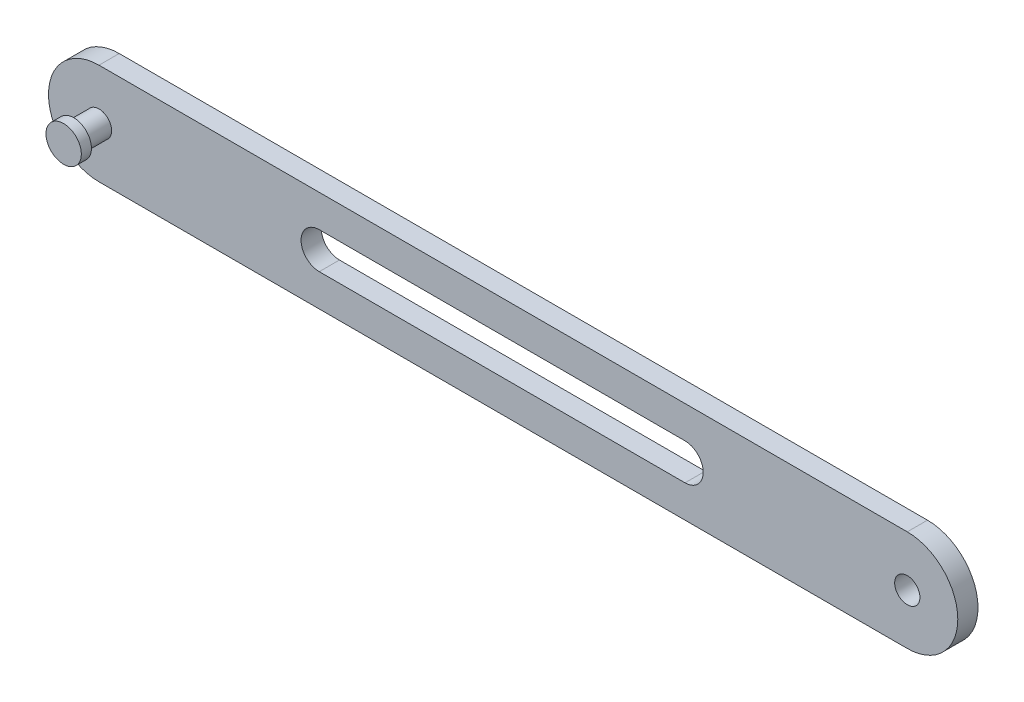
ISO-10303-21;
HEADER;
FILE_DESCRIPTION(('STEP AP214'),'2;1');
FILE_NAME('part.step','',(''),(''),'','','');
FILE_SCHEMA(('AUTOMOTIVE_DESIGN { 1 0 10303 214 1 1 1 1 }'));
ENDSEC;
DATA;
#1=APPLICATION_CONTEXT('core data for automotive mechanical design processes');
#2=APPLICATION_PROTOCOL_DEFINITION('international standard','automotive_design',2000,#1);
#3=PRODUCT_CONTEXT('',#1,'mechanical');
#4=PRODUCT('Part','Part','',(#3));
#5=PRODUCT_RELATED_PRODUCT_CATEGORY('part','',(#4));
#6=PRODUCT_DEFINITION_FORMATION('','',#4);
#7=PRODUCT_DEFINITION_CONTEXT('part definition',#1,'design');
#8=PRODUCT_DEFINITION('design','',#6,#7);
#9=PRODUCT_DEFINITION_SHAPE('','',#8);
#10=(LENGTH_UNIT() NAMED_UNIT(*) SI_UNIT(.MILLI.,.METRE.));
#11=(NAMED_UNIT(*) PLANE_ANGLE_UNIT() SI_UNIT($,.RADIAN.));
#12=(NAMED_UNIT(*) SI_UNIT($,.STERADIAN.) SOLID_ANGLE_UNIT());
#13=UNCERTAINTY_MEASURE_WITH_UNIT(LENGTH_MEASURE(1.E-05),#10,'distance_accuracy_value','');
#14=(GEOMETRIC_REPRESENTATION_CONTEXT(3) GLOBAL_UNCERTAINTY_ASSIGNED_CONTEXT((#13)) GLOBAL_UNIT_ASSIGNED_CONTEXT((#10,
#11,#12)) REPRESENTATION_CONTEXT('',''));
#15=CARTESIAN_POINT('',(0.,0.,0.));
#16=DIRECTION('',(0.,0.,1.));
#17=DIRECTION('',(1.,0.,0.));
#18=AXIS2_PLACEMENT_3D('',#15,#16,#17);
#19=CARTESIAN_POINT('',(-101.6,0.,11.43));
#20=DIRECTION('',(0.,0.,-1.));
#21=DIRECTION('',(-1.,0.,0.));
#22=AXIS2_PLACEMENT_3D('',#19,#20,#21);
#23=CYLINDRICAL_SURFACE('',#22,3.175);
#24=CARTESIAN_POINT('',(-101.6,0.,2.54));
#25=DIRECTION('',(0.,0.,1.));
#26=DIRECTION('',(1.,0.,0.));
#27=AXIS2_PLACEMENT_3D('',#24,#25,#26);
#28=CIRCLE('',#27,3.175);
#29=CARTESIAN_POINT('',(-98.425,0.,2.54));
#30=VERTEX_POINT('',#29);
#31=EDGE_CURVE('E127',#30,#30,#28,.T.);
#32=ORIENTED_EDGE('',*,*,#31,.T.);
#33=EDGE_LOOP('',(#32));
#34=FACE_BOUND('',#33,.T.);
#35=CARTESIAN_POINT('',(-101.6,0.,8.89));
#36=DIRECTION('',(0.,0.,1.));
#37=DIRECTION('',(1.,0.,0.));
#38=AXIS2_PLACEMENT_3D('',#35,#36,#37);
#39=CIRCLE('',#38,3.175);
#40=CARTESIAN_POINT('',(-98.425,0.,8.89));
#41=VERTEX_POINT('',#40);
#42=EDGE_CURVE('E11',#41,#41,#39,.T.);
#43=ORIENTED_EDGE('',*,*,#42,.F.);
#44=EDGE_LOOP('',(#43));
#45=FACE_BOUND('',#44,.T.);
#46=ADVANCED_FACE('F38',(#34,#45),#23,.T.);
#47=CARTESIAN_POINT('',(-101.6,0.,2.54));
#48=DIRECTION('',(0.,0.,1.));
#49=DIRECTION('',(1.,0.,0.));
#50=AXIS2_PLACEMENT_3D('',#47,#48,#49);
#51=PLANE('',#50);
#52=CARTESIAN_POINT('',(-101.6,0.,2.54));
#53=DIRECTION('',(0.,0.,1.));
#54=DIRECTION('',(1.,0.,0.));
#55=AXIS2_PLACEMENT_3D('',#52,#53,#54);
#56=CIRCLE('',#55,12.7);
#57=CARTESIAN_POINT('',(-101.6,12.7,2.54));
#58=VERTEX_POINT('',#57);
#59=CARTESIAN_POINT('',(-101.6,-12.7,2.54));
#60=VERTEX_POINT('',#59);
#61=EDGE_CURVE('E149',#58,#60,#56,.T.);
#62=ORIENTED_EDGE('',*,*,#61,.T.);
#63=DIRECTION('',(1.,0.,0.));
#64=VECTOR('',#63,1.);
#65=CARTESIAN_POINT('',(-101.6,-12.7,2.54));
#66=LINE('',#65,#64);
#67=CARTESIAN_POINT('',(101.6,-12.7,2.54));
#68=VERTEX_POINT('',#67);
#69=EDGE_CURVE('E152',#60,#68,#66,.T.);
#70=ORIENTED_EDGE('',*,*,#69,.T.);
#71=CARTESIAN_POINT('',(101.6,0.,2.54));
#72=DIRECTION('',(0.,0.,1.));
#73=DIRECTION('',(1.,0.,0.));
#74=AXIS2_PLACEMENT_3D('',#71,#72,#73);
#75=CIRCLE('',#74,12.7);
#76=CARTESIAN_POINT('',(101.6,12.7,2.54));
#77=VERTEX_POINT('',#76);
#78=EDGE_CURVE('E155',#68,#77,#75,.T.);
#79=ORIENTED_EDGE('',*,*,#78,.T.);
#80=DIRECTION('',(1.,0.,0.));
#81=VECTOR('',#80,1.);
#82=CARTESIAN_POINT('',(-101.6,12.7,2.54));
#83=LINE('',#82,#81);
#84=EDGE_CURVE('E157',#58,#77,#83,.T.);
#85=ORIENTED_EDGE('',*,*,#84,.F.);
#86=EDGE_LOOP('',(#62,#70,#79,#85));
#87=FACE_BOUND('',#86,.T.);
#88=CARTESIAN_POINT('',(101.6,0.,2.54));
#89=DIRECTION('',(0.,0.,1.));
#90=DIRECTION('',(1.,0.,0.));
#91=AXIS2_PLACEMENT_3D('',#88,#89,#90);
#92=CIRCLE('',#91,3.175);
#93=CARTESIAN_POINT('',(104.775,0.,2.54));
#94=VERTEX_POINT('',#93);
#95=EDGE_CURVE('E139',#94,#94,#92,.T.);
#96=ORIENTED_EDGE('',*,*,#95,.F.);
#97=EDGE_LOOP('',(#96));
#98=FACE_BOUND('',#97,.T.);
#99=CARTESIAN_POINT('',(-46.228,0.,2.54));
#100=DIRECTION('',(0.,0.,1.));
#101=DIRECTION('',(1.,0.,0.));
#102=AXIS2_PLACEMENT_3D('',#99,#100,#101);
#103=CIRCLE('',#102,4.572);
#104=CARTESIAN_POINT('',(-46.228,4.572,2.54));
#105=VERTEX_POINT('',#104);
#106=CARTESIAN_POINT('',(-46.228,-4.572,2.54));
#107=VERTEX_POINT('',#106);
#108=EDGE_CURVE('E53',#105,#107,#103,.T.);
#109=ORIENTED_EDGE('',*,*,#108,.F.);
#110=DIRECTION('',(-1.,0.,0.));
#111=VECTOR('',#110,1.);
#112=CARTESIAN_POINT('',(-46.228,4.572,2.54));
#113=LINE('',#112,#111);
#114=CARTESIAN_POINT('',(45.72,4.572,2.54));
#115=VERTEX_POINT('',#114);
#116=EDGE_CURVE('E121',#115,#105,#113,.T.);
#117=ORIENTED_EDGE('',*,*,#116,.F.);
#118=CARTESIAN_POINT('',(45.72,0.,2.54));
#119=DIRECTION('',(0.,0.,1.));
#120=DIRECTION('',(1.,0.,0.));
#121=AXIS2_PLACEMENT_3D('',#118,#119,#120);
#122=CIRCLE('',#121,4.572);
#123=CARTESIAN_POINT('',(45.72,-4.572,2.54));
#124=VERTEX_POINT('',#123);
#125=EDGE_CURVE('E124',#124,#115,#122,.T.);
#126=ORIENTED_EDGE('',*,*,#125,.F.);
#127=DIRECTION('',(1.,0.,0.));
#128=VECTOR('',#127,1.);
#129=CARTESIAN_POINT('',(-46.228,-4.572,2.54));
#130=LINE('',#129,#128);
#131=EDGE_CURVE('E133',#107,#124,#130,.T.);
#132=ORIENTED_EDGE('',*,*,#131,.F.);
#133=EDGE_LOOP('',(#109,#117,#126,#132));
#134=FACE_BOUND('',#133,.T.);
#135=ORIENTED_EDGE('',*,*,#31,.F.);
#136=EDGE_LOOP('',(#135));
#137=FACE_BOUND('',#136,.T.);
#138=ADVANCED_FACE('F194',(#87,#98,#134,#137),#51,.T.);
#139=CARTESIAN_POINT('',(-101.6,0.,2.54));
#140=DIRECTION('',(0.,0.,-1.));
#141=DIRECTION('',(-1.,0.,0.));
#142=AXIS2_PLACEMENT_3D('',#139,#140,#141);
#143=CYLINDRICAL_SURFACE('',#142,12.7);
#144=CARTESIAN_POINT('',(-101.6,0.,-2.54));
#145=DIRECTION('',(0.,0.,1.));
#146=DIRECTION('',(1.,0.,0.));
#147=AXIS2_PLACEMENT_3D('',#144,#145,#146);
#148=CIRCLE('',#147,12.7);
#149=CARTESIAN_POINT('',(-101.6,12.7,-2.54));
#150=VERTEX_POINT('',#149);
#151=CARTESIAN_POINT('',(-101.6,-12.7,-2.54));
#152=VERTEX_POINT('',#151);
#153=EDGE_CURVE('E146',#150,#152,#148,.T.);
#154=ORIENTED_EDGE('',*,*,#153,.T.);
#155=DIRECTION('',(0.,0.,-1.));
#156=VECTOR('',#155,1.);
#157=CARTESIAN_POINT('',(-101.6,-12.7,2.54));
#158=LINE('',#157,#156);
#159=EDGE_CURVE('E46',#60,#152,#158,.T.);
#160=ORIENTED_EDGE('',*,*,#159,.F.);
#161=ORIENTED_EDGE('',*,*,#61,.F.);
#162=DIRECTION('',(0.,0.,-1.));
#163=VECTOR('',#162,1.);
#164=CARTESIAN_POINT('',(-101.6,12.7,2.54));
#165=LINE('',#164,#163);
#166=EDGE_CURVE('E160',#58,#150,#165,.T.);
#167=ORIENTED_EDGE('',*,*,#166,.T.);
#168=EDGE_LOOP('',(#154,#160,#161,#167));
#169=FACE_BOUND('',#168,.T.);
#170=ADVANCED_FACE('F40',(#169),#143,.T.);
#171=CARTESIAN_POINT('',(-101.6,-12.7,2.54));
#172=DIRECTION('',(0.,1.,0.));
#173=DIRECTION('',(-1.,0.,0.));
#174=AXIS2_PLACEMENT_3D('',#171,#172,#173);
#175=PLANE('',#174);
#176=DIRECTION('',(1.,0.,0.));
#177=VECTOR('',#176,1.);
#178=CARTESIAN_POINT('',(-101.6,-12.7,-2.54));
#179=LINE('',#178,#177);
#180=CARTESIAN_POINT('',(101.6,-12.7,-2.54));
#181=VERTEX_POINT('',#180);
#182=EDGE_CURVE('E163',#152,#181,#179,.T.);
#183=ORIENTED_EDGE('',*,*,#182,.T.);
#184=DIRECTION('',(0.,0.,-1.));
#185=VECTOR('',#184,1.);
#186=CARTESIAN_POINT('',(101.6,-12.7,2.54));
#187=LINE('',#186,#185);
#188=EDGE_CURVE('E173',#68,#181,#187,.T.);
#189=ORIENTED_EDGE('',*,*,#188,.F.);
#190=ORIENTED_EDGE('',*,*,#69,.F.);
#191=ORIENTED_EDGE('',*,*,#159,.T.);
#192=EDGE_LOOP('',(#183,#189,#190,#191));
#193=FACE_BOUND('',#192,.T.);
#194=ADVANCED_FACE('F178',(#193),#175,.F.);
#195=CARTESIAN_POINT('',(101.6,0.,2.54));
#196=DIRECTION('',(0.,0.,-1.));
#197=DIRECTION('',(-1.,0.,0.));
#198=AXIS2_PLACEMENT_3D('',#195,#196,#197);
#199=CYLINDRICAL_SURFACE('',#198,12.7);
#200=CARTESIAN_POINT('',(101.6,0.,-2.54));
#201=DIRECTION('',(0.,0.,1.));
#202=DIRECTION('',(1.,0.,0.));
#203=AXIS2_PLACEMENT_3D('',#200,#201,#202);
#204=CIRCLE('',#203,12.7);
#205=CARTESIAN_POINT('',(101.6,12.7,-2.54));
#206=VERTEX_POINT('',#205);
#207=EDGE_CURVE('E165',#181,#206,#204,.T.);
#208=ORIENTED_EDGE('',*,*,#207,.T.);
#209=DIRECTION('',(0.,0.,-1.));
#210=VECTOR('',#209,1.);
#211=CARTESIAN_POINT('',(101.6,12.7,2.54));
#212=LINE('',#211,#210);
#213=EDGE_CURVE('E171',#77,#206,#212,.T.);
#214=ORIENTED_EDGE('',*,*,#213,.F.);
#215=ORIENTED_EDGE('',*,*,#78,.F.);
#216=ORIENTED_EDGE('',*,*,#188,.T.);
#217=EDGE_LOOP('',(#208,#214,#215,#216));
#218=FACE_BOUND('',#217,.T.);
#219=ADVANCED_FACE('F192',(#218),#199,.T.);
#220=CARTESIAN_POINT('',(-101.6,12.7,2.54));
#221=DIRECTION('',(0.,1.,0.));
#222=DIRECTION('',(-1.,0.,0.));
#223=AXIS2_PLACEMENT_3D('',#220,#221,#222);
#224=PLANE('',#223);
#225=DIRECTION('',(1.,0.,0.));
#226=VECTOR('',#225,1.);
#227=CARTESIAN_POINT('',(-101.6,12.7,-2.54));
#228=LINE('',#227,#226);
#229=EDGE_CURVE('E153',#150,#206,#228,.T.);
#230=ORIENTED_EDGE('',*,*,#229,.F.);
#231=ORIENTED_EDGE('',*,*,#166,.F.);
#232=ORIENTED_EDGE('',*,*,#84,.T.);
#233=ORIENTED_EDGE('',*,*,#213,.T.);
#234=EDGE_LOOP('',(#230,#231,#232,#233));
#235=FACE_BOUND('',#234,.T.);
#236=ADVANCED_FACE('F187',(#235),#224,.T.);
#237=CARTESIAN_POINT('',(-101.6,0.,-2.54));
#238=DIRECTION('',(0.,0.,1.));
#239=DIRECTION('',(1.,0.,0.));
#240=AXIS2_PLACEMENT_3D('',#237,#238,#239);
#241=PLANE('',#240);
#242=DIRECTION('',(-1.,0.,0.));
#243=VECTOR('',#242,1.);
#244=CARTESIAN_POINT('',(-46.228,4.572,-2.54));
#245=LINE('',#244,#243);
#246=CARTESIAN_POINT('',(45.72,4.572,-2.54));
#247=VERTEX_POINT('',#246);
#248=CARTESIAN_POINT('',(-46.228,4.572,-2.54));
#249=VERTEX_POINT('',#248);
#250=EDGE_CURVE('E111',#247,#249,#245,.T.);
#251=ORIENTED_EDGE('',*,*,#250,.T.);
#252=CARTESIAN_POINT('',(-46.228,0.,-2.54));
#253=DIRECTION('',(0.,0.,1.));
#254=DIRECTION('',(1.,0.,0.));
#255=AXIS2_PLACEMENT_3D('',#252,#253,#254);
#256=CIRCLE('',#255,4.572);
#257=CARTESIAN_POINT('',(-46.228,-4.572,-2.54));
#258=VERTEX_POINT('',#257);
#259=EDGE_CURVE('E105',#249,#258,#256,.T.);
#260=ORIENTED_EDGE('',*,*,#259,.T.);
#261=DIRECTION('',(1.,0.,0.));
#262=VECTOR('',#261,1.);
#263=CARTESIAN_POINT('',(-46.228,-4.572,-2.54));
#264=LINE('',#263,#262);
#265=CARTESIAN_POINT('',(45.72,-4.572,-2.54));
#266=VERTEX_POINT('',#265);
#267=EDGE_CURVE('E114',#258,#266,#264,.T.);
#268=ORIENTED_EDGE('',*,*,#267,.T.);
#269=CARTESIAN_POINT('',(45.72,0.,-2.54));
#270=DIRECTION('',(0.,0.,1.));
#271=DIRECTION('',(1.,0.,0.));
#272=AXIS2_PLACEMENT_3D('',#269,#270,#271);
#273=CIRCLE('',#272,4.572);
#274=EDGE_CURVE('E61',#266,#247,#273,.T.);
#275=ORIENTED_EDGE('',*,*,#274,.T.);
#276=EDGE_LOOP('',(#251,#260,#268,#275));
#277=FACE_BOUND('',#276,.T.);
#278=CARTESIAN_POINT('',(101.6,0.,-2.54));
#279=DIRECTION('',(0.,0.,1.));
#280=DIRECTION('',(1.,0.,0.));
#281=AXIS2_PLACEMENT_3D('',#278,#279,#280);
#282=CIRCLE('',#281,3.175);
#283=CARTESIAN_POINT('',(104.775,0.,-2.54));
#284=VERTEX_POINT('',#283);
#285=EDGE_CURVE('E143',#284,#284,#282,.T.);
#286=ORIENTED_EDGE('',*,*,#285,.T.);
#287=EDGE_LOOP('',(#286));
#288=FACE_BOUND('',#287,.T.);
#289=ORIENTED_EDGE('',*,*,#153,.F.);
#290=ORIENTED_EDGE('',*,*,#229,.T.);
#291=ORIENTED_EDGE('',*,*,#207,.F.);
#292=ORIENTED_EDGE('',*,*,#182,.F.);
#293=EDGE_LOOP('',(#289,#290,#291,#292));
#294=FACE_BOUND('',#293,.T.);
#295=ADVANCED_FACE('F118',(#277,#288,#294),#241,.F.);
#296=CARTESIAN_POINT('',(101.6,0.,-2.54));
#297=DIRECTION('',(0.,0.,1.));
#298=DIRECTION('',(1.,0.,0.));
#299=AXIS2_PLACEMENT_3D('',#296,#297,#298);
#300=CYLINDRICAL_SURFACE('',#299,3.175);
#301=ORIENTED_EDGE('',*,*,#285,.F.);
#302=EDGE_LOOP('',(#301));
#303=FACE_BOUND('',#302,.T.);
#304=ORIENTED_EDGE('',*,*,#95,.T.);
#305=EDGE_LOOP('',(#304));
#306=FACE_BOUND('',#305,.T.);
#307=ADVANCED_FACE('F244',(#303,#306),#300,.F.);
#308=CARTESIAN_POINT('',(-46.228,0.,-2.54));
#309=DIRECTION('',(0.,0.,1.));
#310=DIRECTION('',(1.,0.,0.));
#311=AXIS2_PLACEMENT_3D('',#308,#309,#310);
#312=CYLINDRICAL_SURFACE('',#311,4.572);
#313=ORIENTED_EDGE('',*,*,#108,.T.);
#314=DIRECTION('',(0.,0.,1.));
#315=VECTOR('',#314,1.);
#316=CARTESIAN_POINT('',(-46.228,-4.572,-2.54));
#317=LINE('',#316,#315);
#318=EDGE_CURVE('E101',#258,#107,#317,.T.);
#319=ORIENTED_EDGE('',*,*,#318,.F.);
#320=ORIENTED_EDGE('',*,*,#259,.F.);
#321=DIRECTION('',(0.,0.,1.));
#322=VECTOR('',#321,1.);
#323=CARTESIAN_POINT('',(-46.228,4.572,-2.54));
#324=LINE('',#323,#322);
#325=EDGE_CURVE('E137',#249,#105,#324,.T.);
#326=ORIENTED_EDGE('',*,*,#325,.T.);
#327=EDGE_LOOP('',(#313,#319,#320,#326));
#328=FACE_BOUND('',#327,.T.);
#329=ADVANCED_FACE('F103',(#328),#312,.F.);
#330=CARTESIAN_POINT('',(-46.228,4.572,-2.54));
#331=DIRECTION('',(0.,1.,0.));
#332=DIRECTION('',(0.,0.,1.));
#333=AXIS2_PLACEMENT_3D('',#330,#331,#332);
#334=PLANE('',#333);
#335=ORIENTED_EDGE('',*,*,#116,.T.);
#336=ORIENTED_EDGE('',*,*,#325,.F.);
#337=ORIENTED_EDGE('',*,*,#250,.F.);
#338=DIRECTION('',(0.,0.,1.));
#339=VECTOR('',#338,1.);
#340=CARTESIAN_POINT('',(45.72,4.572,-2.54));
#341=LINE('',#340,#339);
#342=EDGE_CURVE('E140',#247,#115,#341,.T.);
#343=ORIENTED_EDGE('',*,*,#342,.T.);
#344=EDGE_LOOP('',(#335,#336,#337,#343));
#345=FACE_BOUND('',#344,.T.);
#346=ADVANCED_FACE('F233',(#345),#334,.F.);
#347=CARTESIAN_POINT('',(45.72,0.,-2.54));
#348=DIRECTION('',(0.,0.,1.));
#349=DIRECTION('',(1.,0.,0.));
#350=AXIS2_PLACEMENT_3D('',#347,#348,#349);
#351=CYLINDRICAL_SURFACE('',#350,4.572);
#352=ORIENTED_EDGE('',*,*,#125,.T.);
#353=ORIENTED_EDGE('',*,*,#342,.F.);
#354=ORIENTED_EDGE('',*,*,#274,.F.);
#355=DIRECTION('',(0.,0.,1.));
#356=VECTOR('',#355,1.);
#357=CARTESIAN_POINT('',(45.72,-4.572,-2.54));
#358=LINE('',#357,#356);
#359=EDGE_CURVE('E110',#266,#124,#358,.T.);
#360=ORIENTED_EDGE('',*,*,#359,.T.);
#361=EDGE_LOOP('',(#352,#353,#354,#360));
#362=FACE_BOUND('',#361,.T.);
#363=ADVANCED_FACE('F236',(#362),#351,.F.);
#364=CARTESIAN_POINT('',(-46.228,-4.572,-2.54));
#365=DIRECTION('',(0.,-1.,0.));
#366=DIRECTION('',(0.,0.,-1.));
#367=AXIS2_PLACEMENT_3D('',#364,#365,#366);
#368=PLANE('',#367);
#369=ORIENTED_EDGE('',*,*,#131,.T.);
#370=ORIENTED_EDGE('',*,*,#359,.F.);
#371=ORIENTED_EDGE('',*,*,#267,.F.);
#372=ORIENTED_EDGE('',*,*,#318,.T.);
#373=EDGE_LOOP('',(#369,#370,#371,#372));
#374=FACE_BOUND('',#373,.T.);
#375=ADVANCED_FACE('F115',(#374),#368,.F.);
#376=CARTESIAN_POINT('',(-101.6,0.,8.89));
#377=DIRECTION('',(0.,0.,1.));
#378=DIRECTION('',(1.,0.,0.));
#379=AXIS2_PLACEMENT_3D('',#376,#377,#378);
#380=PLANE('',#379);
#381=CARTESIAN_POINT('',(-101.6,0.,8.89));
#382=DIRECTION('',(0.,0.,1.));
#383=DIRECTION('',(1.,0.,0.));
#384=AXIS2_PLACEMENT_3D('',#381,#382,#383);
#385=CIRCLE('',#384,4.445);
#386=CARTESIAN_POINT('',(-97.155,0.,8.89));
#387=VERTEX_POINT('',#386);
#388=EDGE_CURVE('E205',#387,#387,#385,.T.);
#389=ORIENTED_EDGE('',*,*,#388,.F.);
#390=EDGE_LOOP('',(#389));
#391=FACE_BOUND('',#390,.T.);
#392=ORIENTED_EDGE('',*,*,#42,.T.);
#393=EDGE_LOOP('',(#392));
#394=FACE_BOUND('',#393,.T.);
#395=ADVANCED_FACE('F218',(#391,#394),#380,.F.);
#396=CARTESIAN_POINT('',(-101.6,0.,8.89));
#397=DIRECTION('',(0.,0.,1.));
#398=DIRECTION('',(1.,0.,0.));
#399=AXIS2_PLACEMENT_3D('',#396,#397,#398);
#400=CYLINDRICAL_SURFACE('',#399,4.445);
#401=ORIENTED_EDGE('',*,*,#388,.T.);
#402=EDGE_LOOP('',(#401));
#403=FACE_BOUND('',#402,.T.);
#404=CARTESIAN_POINT('',(-101.6,0.,11.43));
#405=DIRECTION('',(0.,0.,1.));
#406=DIRECTION('',(1.,0.,0.));
#407=AXIS2_PLACEMENT_3D('',#404,#405,#406);
#408=CIRCLE('',#407,4.445);
#409=CARTESIAN_POINT('',(-97.155,0.,11.43));
#410=VERTEX_POINT('',#409);
#411=EDGE_CURVE('E207',#410,#410,#408,.T.);
#412=ORIENTED_EDGE('',*,*,#411,.F.);
#413=EDGE_LOOP('',(#412));
#414=FACE_BOUND('',#413,.T.);
#415=ADVANCED_FACE('F216',(#403,#414),#400,.T.);
#416=CARTESIAN_POINT('',(-101.6,0.,11.43));
#417=DIRECTION('',(0.,0.,1.));
#418=DIRECTION('',(1.,0.,0.));
#419=AXIS2_PLACEMENT_3D('',#416,#417,#418);
#420=PLANE('',#419);
#421=ORIENTED_EDGE('',*,*,#411,.T.);
#422=EDGE_LOOP('',(#421));
#423=FACE_BOUND('',#422,.T.);
#424=ADVANCED_FACE('F214',(#423),#420,.T.);
#425=CLOSED_SHELL('',(#46,#138,#170,#194,#219,#236,#295,#307,#329,#346,#363,#375,#395,#415,#424));
#426=MANIFOLD_SOLID_BREP('B2',#425);
#427=ADVANCED_BREP_SHAPE_REPRESENTATION('',(#18,#426),#14);
#428=SHAPE_DEFINITION_REPRESENTATION(#9,#427);
ENDSEC;
END-ISO-10303-21;
